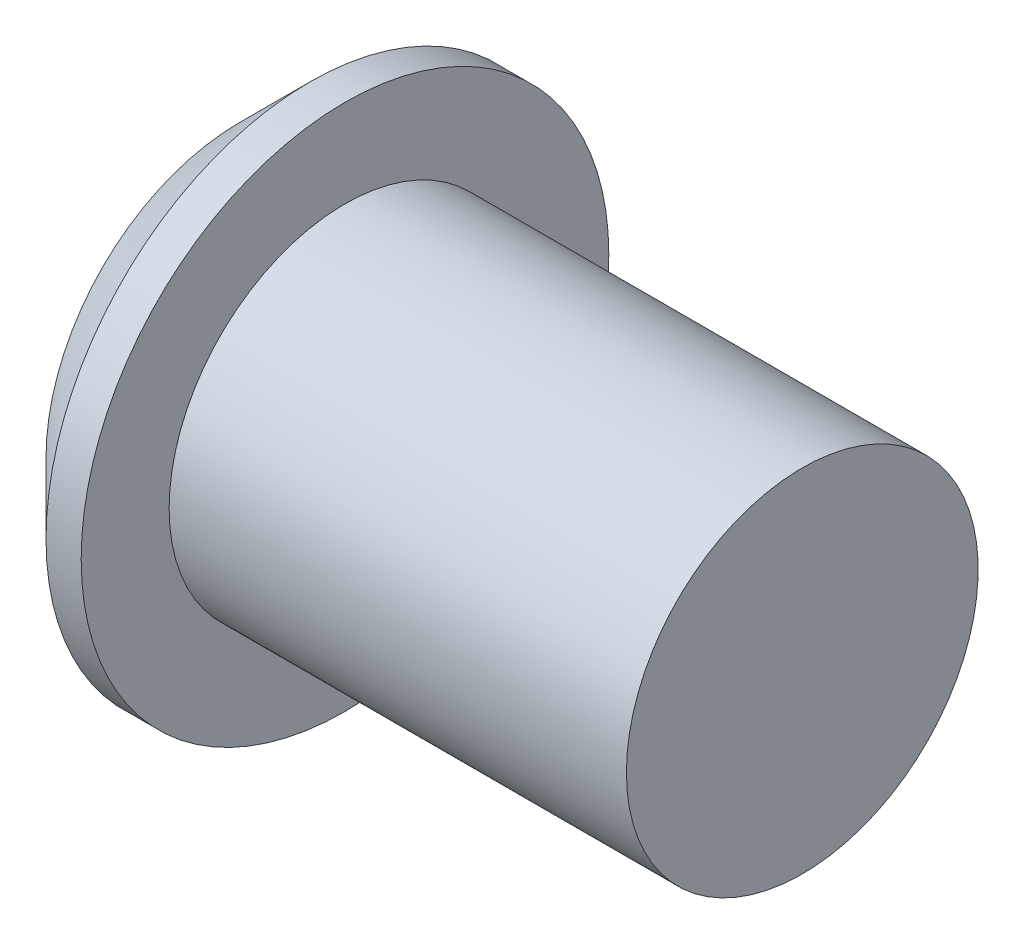
ISO-10303-21;
HEADER;
FILE_DESCRIPTION(('STEP AP214'),'2;1');
FILE_NAME('part.step','',(''),(''),'','','');
FILE_SCHEMA(('AUTOMOTIVE_DESIGN { 1 0 10303 214 1 1 1 1 }'));
ENDSEC;
DATA;
#1=APPLICATION_CONTEXT('core data for automotive mechanical design processes');
#2=APPLICATION_PROTOCOL_DEFINITION('international standard','automotive_design',2000,#1);
#3=PRODUCT_CONTEXT('',#1,'mechanical');
#4=PRODUCT('Part','Part','',(#3));
#5=PRODUCT_RELATED_PRODUCT_CATEGORY('part','',(#4));
#6=PRODUCT_DEFINITION_FORMATION('','',#4);
#7=PRODUCT_DEFINITION_CONTEXT('part definition',#1,'design');
#8=PRODUCT_DEFINITION('design','',#6,#7);
#9=PRODUCT_DEFINITION_SHAPE('','',#8);
#10=(LENGTH_UNIT() NAMED_UNIT(*) SI_UNIT(.MILLI.,.METRE.));
#11=(NAMED_UNIT(*) PLANE_ANGLE_UNIT() SI_UNIT($,.RADIAN.));
#12=(NAMED_UNIT(*) SI_UNIT($,.STERADIAN.) SOLID_ANGLE_UNIT());
#13=UNCERTAINTY_MEASURE_WITH_UNIT(LENGTH_MEASURE(1.E-05),#10,'distance_accuracy_value','');
#14=(GEOMETRIC_REPRESENTATION_CONTEXT(3) GLOBAL_UNCERTAINTY_ASSIGNED_CONTEXT((#13)) GLOBAL_UNIT_ASSIGNED_CONTEXT((#10,
#11,#12)) REPRESENTATION_CONTEXT('',''));
#15=CARTESIAN_POINT('',(0.,0.,0.));
#16=DIRECTION('',(0.,0.,1.));
#17=DIRECTION('',(1.,0.,0.));
#18=AXIS2_PLACEMENT_3D('',#15,#16,#17);
#19=CARTESIAN_POINT('',(13.,0.,0.));
#20=DIRECTION('',(-1.,0.,0.));
#21=DIRECTION('',(0.,0.,1.));
#22=AXIS2_PLACEMENT_3D('',#19,#20,#21);
#23=CYLINDRICAL_SURFACE('',#22,5.);
#24=CARTESIAN_POINT('',(13.,0.,0.));
#25=DIRECTION('',(1.,0.,0.));
#26=DIRECTION('',(0.,0.,-1.));
#27=AXIS2_PLACEMENT_3D('',#24,#25,#26);
#28=CIRCLE('',#27,5.);
#29=CARTESIAN_POINT('',(13.,0.,5.));
#30=VERTEX_POINT('',#29);
#31=EDGE_CURVE('E51',#30,#30,#28,.T.);
#32=CARTESIAN_POINT('',(0.,0.,0.));
#33=DIRECTION('',(1.,0.,0.));
#34=DIRECTION('',(0.,0.,-1.));
#35=AXIS2_PLACEMENT_3D('',#32,#33,#34);
#36=CIRCLE('',#35,5.);
#37=CARTESIAN_POINT('',(0.,0.,5.));
#38=VERTEX_POINT('',#37);
#39=EDGE_CURVE('E55',#38,#38,#36,.T.);
#40=CARTESIAN_POINT('',(13.,0.,5.));
#41=CARTESIAN_POINT('',(12.8645833333333,0.,5.));
#42=CARTESIAN_POINT('',(12.7291666666667,0.,5.));
#43=CARTESIAN_POINT('',(12.4583333333333,0.,5.));
#44=CARTESIAN_POINT('',(12.3229166666667,0.,5.));
#45=CARTESIAN_POINT('',(12.0520833333333,0.,5.));
#46=CARTESIAN_POINT('',(11.9166666666667,0.,5.));
#47=CARTESIAN_POINT('',(11.6458333333333,0.,5.));
#48=CARTESIAN_POINT('',(11.5104166666667,0.,5.));
#49=CARTESIAN_POINT('',(11.2395833333333,0.,5.));
#50=CARTESIAN_POINT('',(11.1041666666667,0.,5.));
#51=CARTESIAN_POINT('',(10.8333333333333,0.,5.));
#52=CARTESIAN_POINT('',(10.6979166666667,0.,5.));
#53=CARTESIAN_POINT('',(10.4270833333333,0.,5.));
#54=CARTESIAN_POINT('',(10.2916666666667,0.,5.));
#55=CARTESIAN_POINT('',(10.0208333333333,0.,5.));
#56=CARTESIAN_POINT('',(9.88541666666667,0.,5.));
#57=CARTESIAN_POINT('',(9.61458333333333,0.,5.));
#58=CARTESIAN_POINT('',(9.47916666666667,0.,5.));
#59=CARTESIAN_POINT('',(9.20833333333333,0.,5.));
#60=CARTESIAN_POINT('',(9.07291666666667,0.,5.));
#61=CARTESIAN_POINT('',(8.80208333333333,0.,5.));
#62=CARTESIAN_POINT('',(8.66666666666667,0.,5.));
#63=CARTESIAN_POINT('',(8.39583333333333,0.,5.));
#64=CARTESIAN_POINT('',(8.26041666666667,0.,5.));
#65=CARTESIAN_POINT('',(7.98958333333333,0.,5.));
#66=CARTESIAN_POINT('',(7.85416666666667,0.,5.));
#67=CARTESIAN_POINT('',(7.58333333333333,0.,5.));
#68=CARTESIAN_POINT('',(7.44791666666667,0.,5.));
#69=CARTESIAN_POINT('',(7.17708333333333,0.,5.));
#70=CARTESIAN_POINT('',(7.04166666666667,0.,5.));
#71=CARTESIAN_POINT('',(6.77083333333333,0.,5.));
#72=CARTESIAN_POINT('',(6.63541666666667,0.,5.));
#73=CARTESIAN_POINT('',(6.36458333333333,0.,5.));
#74=CARTESIAN_POINT('',(6.22916666666667,0.,5.));
#75=CARTESIAN_POINT('',(5.95833333333333,0.,5.));
#76=CARTESIAN_POINT('',(5.82291666666667,0.,5.));
#77=CARTESIAN_POINT('',(5.55208333333333,0.,5.));
#78=CARTESIAN_POINT('',(5.41666666666667,0.,5.));
#79=CARTESIAN_POINT('',(5.14583333333333,0.,5.));
#80=CARTESIAN_POINT('',(5.01041666666667,0.,5.));
#81=CARTESIAN_POINT('',(4.73958333333333,0.,5.));
#82=CARTESIAN_POINT('',(4.60416666666667,0.,5.));
#83=CARTESIAN_POINT('',(4.33333333333333,0.,5.));
#84=CARTESIAN_POINT('',(4.19791666666667,0.,5.));
#85=CARTESIAN_POINT('',(3.92708333333333,0.,5.));
#86=CARTESIAN_POINT('',(3.79166666666667,0.,5.));
#87=CARTESIAN_POINT('',(3.52083333333333,0.,5.));
#88=CARTESIAN_POINT('',(3.38541666666667,0.,5.));
#89=CARTESIAN_POINT('',(3.11458333333333,0.,5.));
#90=CARTESIAN_POINT('',(2.97916666666667,0.,5.));
#91=CARTESIAN_POINT('',(2.70833333333333,0.,5.));
#92=CARTESIAN_POINT('',(2.57291666666667,0.,5.));
#93=CARTESIAN_POINT('',(2.30208333333333,0.,5.));
#94=CARTESIAN_POINT('',(2.16666666666667,0.,5.));
#95=CARTESIAN_POINT('',(1.89583333333333,0.,5.));
#96=CARTESIAN_POINT('',(1.76041666666667,0.,5.));
#97=CARTESIAN_POINT('',(1.48958333333333,0.,5.));
#98=CARTESIAN_POINT('',(1.35416666666667,0.,5.));
#99=CARTESIAN_POINT('',(1.08333333333333,0.,5.));
#100=CARTESIAN_POINT('',(0.947916666666667,0.,5.));
#101=CARTESIAN_POINT('',(0.677083333333334,0.,5.));
#102=CARTESIAN_POINT('',(0.541666666666667,0.,5.));
#103=CARTESIAN_POINT('',(0.270833333333334,0.,5.));
#104=CARTESIAN_POINT('',(0.135416666666667,0.,5.));
#105=CARTESIAN_POINT('',(0.,0.,5.));
#106=B_SPLINE_CURVE_WITH_KNOTS('',3,(#40,#41,#42,#43,#44,#45,#46,#47,#48,#49,#50,#51,#52,#53,
#54,#55,#56,#57,#58,#59,#60,#61,#62,#63,#64,#65,#66,#67,#68,#69,#70,#71,#72,#73,#74,#75,#76,#77,
#78,#79,#80,#81,#82,#83,#84,#85,#86,#87,#88,#89,#90,#91,#92,#93,#94,#95,#96,#97,#98,#99,#100,
#101,#102,#103,#104,#105),.UNSPECIFIED.,.F.,.F.,(4,2,2,2,2,2,2,2,2,2,2,2,2,2,2,2,2,2,2,2,2,2,2,
2,2,2,2,2,2,2,2,2,4),(0.,0.406249999999999,0.812499999999999,1.21875,1.625,2.03125,2.4375,
2.84375,3.25,3.65625,4.0625,4.46875,4.875,5.28125,5.6875,6.09375,6.5,6.90625,7.3125,7.71875,
8.125,8.53125,8.9375,9.34375,9.75,10.15625,10.5625,10.96875,11.375,11.78125,12.1875,12.59375,
13.),.UNSPECIFIED.);
#107=EDGE_CURVE('BSEAM39',#30,#38,#106,.T.);
#108=ORIENTED_EDGE('',*,*,#31,.F.);
#109=ORIENTED_EDGE('',*,*,#39,.T.);
#110=ORIENTED_EDGE('',*,*,#107,.T.);
#111=ORIENTED_EDGE('',*,*,#107,.F.);
#112=EDGE_LOOP('',(#108,#110,#109,#111));
#113=FACE_BOUND('',#112,.T.);
#114=ADVANCED_FACE('F39',(#113),#23,.T.);
#115=CARTESIAN_POINT('',(13.,0.,0.));
#116=DIRECTION('',(1.,0.,0.));
#117=DIRECTION('',(0.,0.,-1.));
#118=AXIS2_PLACEMENT_3D('',#115,#116,#117);
#119=PLANE('',#118);
#120=ORIENTED_EDGE('',*,*,#31,.T.);
#121=EDGE_LOOP('',(#120));
#122=FACE_BOUND('',#121,.T.);
#123=ADVANCED_FACE('F82',(#122),#119,.T.);
#124=CARTESIAN_POINT('',(-3.,0.,0.));
#125=DIRECTION('',(1.,0.,0.));
#126=DIRECTION('',(0.,0.,-1.));
#127=AXIS2_PLACEMENT_3D('',#124,#125,#126);
#128=CYLINDRICAL_SURFACE('',#127,7.5);
#129=CARTESIAN_POINT('',(-1.,0.,0.));
#130=DIRECTION('',(-1.,0.,0.));
#131=DIRECTION('',(0.,0.,1.));
#132=AXIS2_PLACEMENT_3D('',#129,#130,#131);
#133=CIRCLE('',#132,7.5);
#134=CARTESIAN_POINT('',(-1.,0.,7.5));
#135=VERTEX_POINT('',#134);
#136=EDGE_CURVE('E10',#135,#135,#133,.F.);
#137=ORIENTED_EDGE('',*,*,#136,.T.);
#138=EDGE_LOOP('',(#137));
#139=FACE_BOUND('',#138,.T.);
#140=CARTESIAN_POINT('',(0.,0.,0.));
#141=DIRECTION('',(-1.,0.,0.));
#142=DIRECTION('',(0.,0.,1.));
#143=AXIS2_PLACEMENT_3D('',#140,#141,#142);
#144=CIRCLE('',#143,7.5);
#145=CARTESIAN_POINT('',(0.,0.,7.5));
#146=VERTEX_POINT('',#145);
#147=EDGE_CURVE('E59',#146,#146,#144,.T.);
#148=ORIENTED_EDGE('',*,*,#147,.T.);
#149=EDGE_LOOP('',(#148));
#150=FACE_BOUND('',#149,.T.);
#151=ADVANCED_FACE('F64',(#139,#150),#128,.T.);
#152=CARTESIAN_POINT('',(-3.,0.,0.));
#153=DIRECTION('',(-1.,0.,0.));
#154=DIRECTION('',(0.,0.,1.));
#155=AXIS2_PLACEMENT_3D('',#152,#153,#154);
#156=PLANE('',#155);
#157=CARTESIAN_POINT('',(-3.,0.,0.));
#158=DIRECTION('',(-1.,0.,0.));
#159=DIRECTION('',(0.,0.,1.));
#160=AXIS2_PLACEMENT_3D('',#157,#158,#159);
#161=CIRCLE('',#160,5.5);
#162=CARTESIAN_POINT('',(-3.,0.,5.5));
#163=VERTEX_POINT('',#162);
#164=EDGE_CURVE('E47',#163,#163,#161,.T.);
#165=ORIENTED_EDGE('',*,*,#164,.T.);
#166=EDGE_LOOP('',(#165));
#167=FACE_BOUND('',#166,.T.);
#168=ADVANCED_FACE('F68',(#167),#156,.T.);
#169=CARTESIAN_POINT('',(0.,0.,0.));
#170=DIRECTION('',(-1.,0.,0.));
#171=DIRECTION('',(0.,0.,1.));
#172=AXIS2_PLACEMENT_3D('',#169,#170,#171);
#173=PLANE('',#172);
#174=ORIENTED_EDGE('',*,*,#39,.F.);
#175=EDGE_LOOP('',(#174));
#176=FACE_BOUND('',#175,.T.);
#177=ORIENTED_EDGE('',*,*,#147,.F.);
#178=EDGE_LOOP('',(#177));
#179=FACE_BOUND('',#178,.T.);
#180=ADVANCED_FACE('F66',(#176,#179),#173,.F.);
#181=CARTESIAN_POINT('',(-3.,0.,0.));
#182=DIRECTION('',(1.,0.,0.));
#183=DIRECTION('',(0.,0.,-1.));
#184=AXIS2_PLACEMENT_3D('',#181,#182,#183);
#185=CONICAL_SURFACE('',#184,5.5,0.785398163397447);
#186=ORIENTED_EDGE('',*,*,#136,.F.);
#187=EDGE_LOOP('',(#186));
#188=FACE_BOUND('',#187,.T.);
#189=ORIENTED_EDGE('',*,*,#164,.F.);
#190=EDGE_LOOP('',(#189));
#191=FACE_BOUND('',#190,.T.);
#192=ADVANCED_FACE('F42',(#188,#191),#185,.T.);
#193=CLOSED_SHELL('',(#114,#123,#151,#168,#180,#192));
#194=MANIFOLD_SOLID_BREP('B2',#193);
#195=ADVANCED_BREP_SHAPE_REPRESENTATION('',(#18,#194),#14);
#196=SHAPE_DEFINITION_REPRESENTATION(#9,#195);
ENDSEC;
END-ISO-10303-21;
